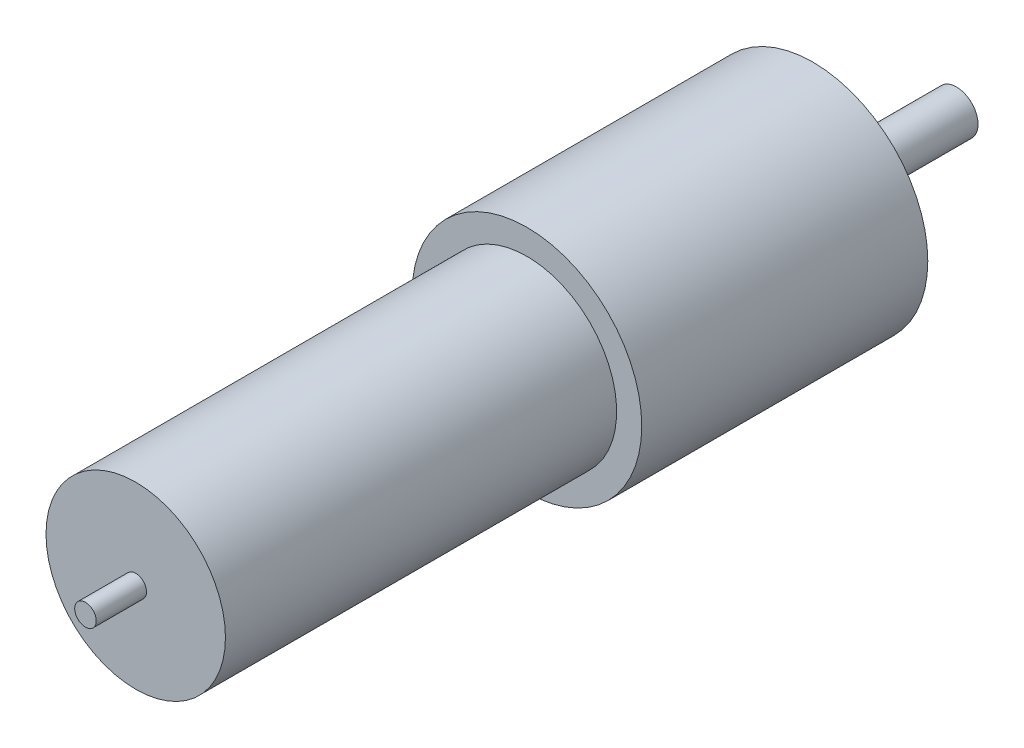
ISO-10303-21;
HEADER;
FILE_DESCRIPTION(('STEP AP214'),'2;1');
FILE_NAME('part.step','',(''),(''),'','','');
FILE_SCHEMA(('AUTOMOTIVE_DESIGN { 1 0 10303 214 1 1 1 1 }'));
ENDSEC;
DATA;
#1=APPLICATION_CONTEXT('core data for automotive mechanical design processes');
#2=APPLICATION_PROTOCOL_DEFINITION('international standard','automotive_design',2000,#1);
#3=PRODUCT_CONTEXT('',#1,'mechanical');
#4=PRODUCT('Part','Part','',(#3));
#5=PRODUCT_RELATED_PRODUCT_CATEGORY('part','',(#4));
#6=PRODUCT_DEFINITION_FORMATION('','',#4);
#7=PRODUCT_DEFINITION_CONTEXT('part definition',#1,'design');
#8=PRODUCT_DEFINITION('design','',#6,#7);
#9=PRODUCT_DEFINITION_SHAPE('','',#8);
#10=(LENGTH_UNIT() NAMED_UNIT(*) SI_UNIT(.MILLI.,.METRE.));
#11=(NAMED_UNIT(*) PLANE_ANGLE_UNIT() SI_UNIT($,.RADIAN.));
#12=(NAMED_UNIT(*) SI_UNIT($,.STERADIAN.) SOLID_ANGLE_UNIT());
#13=UNCERTAINTY_MEASURE_WITH_UNIT(LENGTH_MEASURE(1.E-05),#10,'distance_accuracy_value','');
#14=(GEOMETRIC_REPRESENTATION_CONTEXT(3) GLOBAL_UNCERTAINTY_ASSIGNED_CONTEXT((#13)) GLOBAL_UNIT_ASSIGNED_CONTEXT((#10,
#11,#12)) REPRESENTATION_CONTEXT('',''));
#15=CARTESIAN_POINT('',(0.,0.,0.));
#16=DIRECTION('',(0.,0.,1.));
#17=DIRECTION('',(1.,0.,0.));
#18=AXIS2_PLACEMENT_3D('',#15,#16,#17);
#19=CARTESIAN_POINT('',(0.,0.,54.5));
#20=DIRECTION('',(0.,0.,-1.));
#21=DIRECTION('',(-1.,0.,0.));
#22=AXIS2_PLACEMENT_3D('',#19,#20,#21);
#23=CYLINDRICAL_SURFACE('',#22,12.5);
#24=CARTESIAN_POINT('',(0.,0.,54.5));
#25=DIRECTION('',(0.,0.,1.));
#26=DIRECTION('',(1.,0.,0.));
#27=AXIS2_PLACEMENT_3D('',#24,#25,#26);
#28=CIRCLE('',#27,12.5);
#29=CARTESIAN_POINT('',(12.5,0.,54.5));
#30=VERTEX_POINT('',#29);
#31=EDGE_CURVE('E10',#30,#30,#28,.T.);
#32=ORIENTED_EDGE('',*,*,#31,.F.);
#33=EDGE_LOOP('',(#32));
#34=FACE_BOUND('',#33,.T.);
#35=CARTESIAN_POINT('',(0.,0.,0.));
#36=DIRECTION('',(0.,0.,-1.));
#37=DIRECTION('',(-1.,0.,0.));
#38=AXIS2_PLACEMENT_3D('',#35,#36,#37);
#39=CIRCLE('',#38,12.5);
#40=CARTESIAN_POINT('',(-12.5,0.,0.));
#41=VERTEX_POINT('',#40);
#42=EDGE_CURVE('E48',#41,#41,#39,.T.);
#43=ORIENTED_EDGE('',*,*,#42,.F.);
#44=EDGE_LOOP('',(#43));
#45=FACE_BOUND('',#44,.T.);
#46=ADVANCED_FACE('F33',(#34,#45),#23,.T.);
#47=CARTESIAN_POINT('',(0.,0.,54.5));
#48=DIRECTION('',(0.,0.,1.));
#49=DIRECTION('',(1.,0.,0.));
#50=AXIS2_PLACEMENT_3D('',#47,#48,#49);
#51=PLANE('',#50);
#52=CARTESIAN_POINT('',(0.,0.,54.5));
#53=DIRECTION('',(0.,0.,1.));
#54=DIRECTION('',(1.,0.,0.));
#55=AXIS2_PLACEMENT_3D('',#52,#53,#54);
#56=CIRCLE('',#55,1.5);
#57=CARTESIAN_POINT('',(1.5,0.,54.5));
#58=VERTEX_POINT('',#57);
#59=EDGE_CURVE('E43',#58,#58,#56,.T.);
#60=ORIENTED_EDGE('',*,*,#59,.F.);
#61=EDGE_LOOP('',(#60));
#62=FACE_BOUND('',#61,.T.);
#63=ORIENTED_EDGE('',*,*,#31,.T.);
#64=EDGE_LOOP('',(#63));
#65=FACE_BOUND('',#64,.T.);
#66=ADVANCED_FACE('F93',(#62,#65),#51,.T.);
#67=CARTESIAN_POINT('',(0.,0.,61.5));
#68=DIRECTION('',(0.,0.,-1.));
#69=DIRECTION('',(-1.,0.,0.));
#70=AXIS2_PLACEMENT_3D('',#67,#68,#69);
#71=CYLINDRICAL_SURFACE('',#70,1.5);
#72=CARTESIAN_POINT('',(0.,0.,61.5));
#73=DIRECTION('',(0.,0.,1.));
#74=DIRECTION('',(1.,0.,0.));
#75=AXIS2_PLACEMENT_3D('',#72,#73,#74);
#76=CIRCLE('',#75,1.5);
#77=CARTESIAN_POINT('',(1.5,0.,61.5));
#78=VERTEX_POINT('',#77);
#79=EDGE_CURVE('E39',#78,#78,#76,.T.);
#80=ORIENTED_EDGE('',*,*,#79,.F.);
#81=EDGE_LOOP('',(#80));
#82=FACE_BOUND('',#81,.T.);
#83=ORIENTED_EDGE('',*,*,#59,.T.);
#84=EDGE_LOOP('',(#83));
#85=FACE_BOUND('',#84,.T.);
#86=ADVANCED_FACE('F98',(#82,#85),#71,.T.);
#87=CARTESIAN_POINT('',(0.,0.,61.5));
#88=DIRECTION('',(0.,0.,1.));
#89=DIRECTION('',(1.,0.,0.));
#90=AXIS2_PLACEMENT_3D('',#87,#88,#89);
#91=PLANE('',#90);
#92=ORIENTED_EDGE('',*,*,#79,.T.);
#93=EDGE_LOOP('',(#92));
#94=FACE_BOUND('',#93,.T.);
#95=ADVANCED_FACE('F83',(#94),#91,.T.);
#96=CARTESIAN_POINT('',(0.,0.,-39.85));
#97=DIRECTION('',(0.,0.,1.));
#98=DIRECTION('',(1.,0.,0.));
#99=AXIS2_PLACEMENT_3D('',#96,#97,#98);
#100=CYLINDRICAL_SURFACE('',#99,16.);
#101=CARTESIAN_POINT('',(0.,0.,-39.85));
#102=DIRECTION('',(0.,0.,-1.));
#103=DIRECTION('',(-1.,0.,0.));
#104=AXIS2_PLACEMENT_3D('',#101,#102,#103);
#105=CIRCLE('',#104,16.);
#106=CARTESIAN_POINT('',(-16.,0.,-39.85));
#107=VERTEX_POINT('',#106);
#108=EDGE_CURVE('E52',#107,#107,#105,.T.);
#109=ORIENTED_EDGE('',*,*,#108,.F.);
#110=EDGE_LOOP('',(#109));
#111=FACE_BOUND('',#110,.T.);
#112=CARTESIAN_POINT('',(0.,0.,0.));
#113=DIRECTION('',(0.,0.,-1.));
#114=DIRECTION('',(-1.,0.,0.));
#115=AXIS2_PLACEMENT_3D('',#112,#113,#114);
#116=CIRCLE('',#115,16.);
#117=CARTESIAN_POINT('',(-16.,0.,0.));
#118=VERTEX_POINT('',#117);
#119=EDGE_CURVE('E53',#118,#118,#116,.T.);
#120=ORIENTED_EDGE('',*,*,#119,.T.);
#121=EDGE_LOOP('',(#120));
#122=FACE_BOUND('',#121,.T.);
#123=ADVANCED_FACE('F77',(#111,#122),#100,.T.);
#124=CARTESIAN_POINT('',(0.,0.,-39.85));
#125=DIRECTION('',(0.,0.,-1.));
#126=DIRECTION('',(-1.,0.,0.));
#127=AXIS2_PLACEMENT_3D('',#124,#125,#126);
#128=PLANE('',#127);
#129=CARTESIAN_POINT('',(0.,0.,-39.85));
#130=DIRECTION('',(0.,0.,-1.));
#131=DIRECTION('',(-1.,0.,0.));
#132=AXIS2_PLACEMENT_3D('',#129,#130,#131);
#133=CIRCLE('',#132,3.);
#134=CARTESIAN_POINT('',(-3.,0.,-39.85));
#135=VERTEX_POINT('',#134);
#136=EDGE_CURVE('E59',#135,#135,#133,.T.);
#137=ORIENTED_EDGE('',*,*,#136,.F.);
#138=EDGE_LOOP('',(#137));
#139=FACE_BOUND('',#138,.T.);
#140=ORIENTED_EDGE('',*,*,#108,.T.);
#141=EDGE_LOOP('',(#140));
#142=FACE_BOUND('',#141,.T.);
#143=ADVANCED_FACE('F74',(#139,#142),#128,.T.);
#144=CARTESIAN_POINT('',(0.,0.,0.));
#145=DIRECTION('',(0.,0.,-1.));
#146=DIRECTION('',(-1.,0.,0.));
#147=AXIS2_PLACEMENT_3D('',#144,#145,#146);
#148=PLANE('',#147);
#149=ORIENTED_EDGE('',*,*,#42,.T.);
#150=EDGE_LOOP('',(#149));
#151=FACE_BOUND('',#150,.T.);
#152=ORIENTED_EDGE('',*,*,#119,.F.);
#153=EDGE_LOOP('',(#152));
#154=FACE_BOUND('',#153,.T.);
#155=ADVANCED_FACE('F70',(#151,#154),#148,.F.);
#156=CARTESIAN_POINT('',(0.,0.,-59.85));
#157=DIRECTION('',(0.,0.,1.));
#158=DIRECTION('',(1.,0.,0.));
#159=AXIS2_PLACEMENT_3D('',#156,#157,#158);
#160=CYLINDRICAL_SURFACE('',#159,3.);
#161=CARTESIAN_POINT('',(0.,0.,-59.85));
#162=DIRECTION('',(0.,0.,-1.));
#163=DIRECTION('',(-1.,0.,0.));
#164=AXIS2_PLACEMENT_3D('',#161,#162,#163);
#165=CIRCLE('',#164,3.);
#166=CARTESIAN_POINT('',(-3.,0.,-59.85));
#167=VERTEX_POINT('',#166);
#168=EDGE_CURVE('E56',#167,#167,#165,.T.);
#169=ORIENTED_EDGE('',*,*,#168,.F.);
#170=EDGE_LOOP('',(#169));
#171=FACE_BOUND('',#170,.T.);
#172=ORIENTED_EDGE('',*,*,#136,.T.);
#173=EDGE_LOOP('',(#172));
#174=FACE_BOUND('',#173,.T.);
#175=ADVANCED_FACE('F67',(#171,#174),#160,.T.);
#176=CARTESIAN_POINT('',(0.,0.,-59.85));
#177=DIRECTION('',(0.,0.,-1.));
#178=DIRECTION('',(-1.,0.,0.));
#179=AXIS2_PLACEMENT_3D('',#176,#177,#178);
#180=PLANE('',#179);
#181=ORIENTED_EDGE('',*,*,#168,.T.);
#182=EDGE_LOOP('',(#181));
#183=FACE_BOUND('',#182,.T.);
#184=ADVANCED_FACE('F65',(#183),#180,.T.);
#185=CLOSED_SHELL('',(#46,#66,#86,#95,#123,#143,#155,#175,#184));
#186=MANIFOLD_SOLID_BREP('B2',#185);
#187=ADVANCED_BREP_SHAPE_REPRESENTATION('',(#18,#186),#14);
#188=SHAPE_DEFINITION_REPRESENTATION(#9,#187);
ENDSEC;
END-ISO-10303-21;
